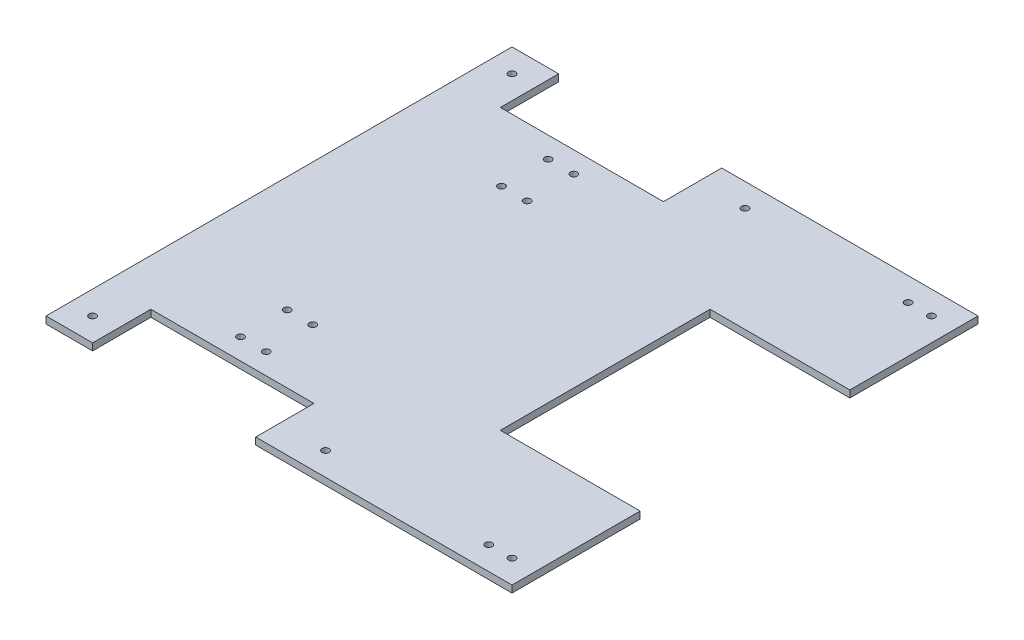
ISO-10303-21;
HEADER;
FILE_DESCRIPTION(('STEP AP214'),'2;1');
FILE_NAME('part.step','',(''),(''),'','','');
FILE_SCHEMA(('AUTOMOTIVE_DESIGN { 1 0 10303 214 1 1 1 1 }'));
ENDSEC;
DATA;
#1=APPLICATION_CONTEXT('core data for automotive mechanical design processes');
#2=APPLICATION_PROTOCOL_DEFINITION('international standard','automotive_design',2000,#1);
#3=PRODUCT_CONTEXT('',#1,'mechanical');
#4=PRODUCT('Part','Part','',(#3));
#5=PRODUCT_RELATED_PRODUCT_CATEGORY('part','',(#4));
#6=PRODUCT_DEFINITION_FORMATION('','',#4);
#7=PRODUCT_DEFINITION_CONTEXT('part definition',#1,'design');
#8=PRODUCT_DEFINITION('design','',#6,#7);
#9=PRODUCT_DEFINITION_SHAPE('','',#8);
#10=(LENGTH_UNIT() NAMED_UNIT(*) SI_UNIT(.MILLI.,.METRE.));
#11=(NAMED_UNIT(*) PLANE_ANGLE_UNIT() SI_UNIT($,.RADIAN.));
#12=(NAMED_UNIT(*) SI_UNIT($,.STERADIAN.) SOLID_ANGLE_UNIT());
#13=UNCERTAINTY_MEASURE_WITH_UNIT(LENGTH_MEASURE(1.E-05),#10,'distance_accuracy_value','');
#14=(GEOMETRIC_REPRESENTATION_CONTEXT(3) GLOBAL_UNCERTAINTY_ASSIGNED_CONTEXT((#13)) GLOBAL_UNIT_ASSIGNED_CONTEXT((#10,
#11,#12)) REPRESENTATION_CONTEXT('',''));
#15=CARTESIAN_POINT('',(0.,0.,0.));
#16=DIRECTION('',(0.,0.,1.));
#17=DIRECTION('',(1.,0.,0.));
#18=AXIS2_PLACEMENT_3D('',#15,#16,#17);
#19=CARTESIAN_POINT('',(180.,3.,130.));
#20=DIRECTION('',(-1.,0.,0.));
#21=DIRECTION('',(0.,0.,1.));
#22=AXIS2_PLACEMENT_3D('',#19,#20,#21);
#23=PLANE('',#22);
#24=DIRECTION('',(0.,0.,-1.));
#25=VECTOR('',#24,1.);
#26=CARTESIAN_POINT('',(180.,0.,130.));
#27=LINE('',#26,#25);
#28=CARTESIAN_POINT('',(180.,0.,130.));
#29=VERTEX_POINT('',#28);
#30=CARTESIAN_POINT('',(180.,0.,75.));
#31=VERTEX_POINT('',#30);
#32=EDGE_CURVE('E184',#29,#31,#27,.T.);
#33=ORIENTED_EDGE('',*,*,#32,.T.);
#34=DIRECTION('',(0.,1.,0.));
#35=VECTOR('',#34,1.);
#36=CARTESIAN_POINT('',(180.,0.,75.));
#37=LINE('',#36,#35);
#38=CARTESIAN_POINT('',(180.,3.,75.));
#39=VERTEX_POINT('',#38);
#40=EDGE_CURVE('E338',#31,#39,#37,.T.);
#41=ORIENTED_EDGE('',*,*,#40,.T.);
#42=DIRECTION('',(0.,0.,-1.));
#43=VECTOR('',#42,1.);
#44=CARTESIAN_POINT('',(180.,3.,130.));
#45=LINE('',#44,#43);
#46=CARTESIAN_POINT('',(180.,3.,130.));
#47=VERTEX_POINT('',#46);
#48=EDGE_CURVE('E247',#47,#39,#45,.T.);
#49=ORIENTED_EDGE('',*,*,#48,.F.);
#50=DIRECTION('',(0.,-1.,0.));
#51=VECTOR('',#50,1.);
#52=CARTESIAN_POINT('',(180.,3.,130.));
#53=LINE('',#52,#51);
#54=EDGE_CURVE('E205',#47,#29,#53,.T.);
#55=ORIENTED_EDGE('',*,*,#54,.T.);
#56=EDGE_LOOP('',(#33,#41,#49,#55));
#57=FACE_BOUND('',#56,.T.);
#58=ADVANCED_FACE('F34',(#57),#23,.F.);
#59=CARTESIAN_POINT('',(-20.,3.,-70.));
#60=DIRECTION('',(1.,0.,0.));
#61=DIRECTION('',(0.,0.,-1.));
#62=AXIS2_PLACEMENT_3D('',#59,#60,#61);
#63=PLANE('',#62);
#64=DIRECTION('',(0.,0.,1.));
#65=VECTOR('',#64,1.);
#66=CARTESIAN_POINT('',(-20.,0.,-70.));
#67=LINE('',#66,#65);
#68=CARTESIAN_POINT('',(-20.,0.,-70.));
#69=VERTEX_POINT('',#68);
#70=CARTESIAN_POINT('',(-20.,0.,130.));
#71=VERTEX_POINT('',#70);
#72=EDGE_CURVE('E169',#69,#71,#67,.T.);
#73=ORIENTED_EDGE('',*,*,#72,.T.);
#74=DIRECTION('',(0.,-1.,0.));
#75=VECTOR('',#74,1.);
#76=CARTESIAN_POINT('',(-20.,3.,130.));
#77=LINE('',#76,#75);
#78=CARTESIAN_POINT('',(-20.,3.,130.));
#79=VERTEX_POINT('',#78);
#80=EDGE_CURVE('E11',#79,#71,#77,.T.);
#81=ORIENTED_EDGE('',*,*,#80,.F.);
#82=DIRECTION('',(0.,0.,1.));
#83=VECTOR('',#82,1.);
#84=CARTESIAN_POINT('',(-20.,3.,-70.));
#85=LINE('',#84,#83);
#86=CARTESIAN_POINT('',(-20.,3.,-70.));
#87=VERTEX_POINT('',#86);
#88=EDGE_CURVE('E195',#87,#79,#85,.T.);
#89=ORIENTED_EDGE('',*,*,#88,.F.);
#90=DIRECTION('',(0.,-1.,0.));
#91=VECTOR('',#90,1.);
#92=CARTESIAN_POINT('',(-20.,3.,-70.));
#93=LINE('',#92,#91);
#94=EDGE_CURVE('E165',#87,#69,#93,.T.);
#95=ORIENTED_EDGE('',*,*,#94,.T.);
#96=EDGE_LOOP('',(#73,#81,#89,#95));
#97=FACE_BOUND('',#96,.T.);
#98=ADVANCED_FACE('F36',(#97),#63,.F.);
#99=CARTESIAN_POINT('',(-20.,3.,130.));
#100=DIRECTION('',(0.,0.,-1.));
#101=DIRECTION('',(-1.,0.,0.));
#102=AXIS2_PLACEMENT_3D('',#99,#100,#101);
#103=PLANE('',#102);
#104=DIRECTION('',(1.,0.,0.));
#105=VECTOR('',#104,1.);
#106=CARTESIAN_POINT('',(-20.,0.,130.));
#107=LINE('',#106,#105);
#108=CARTESIAN_POINT('',(0.,0.,130.));
#109=VERTEX_POINT('',#108);
#110=EDGE_CURVE('E172',#71,#109,#107,.T.);
#111=ORIENTED_EDGE('',*,*,#110,.T.);
#112=DIRECTION('',(0.,-1.,0.));
#113=VECTOR('',#112,1.);
#114=CARTESIAN_POINT('',(0.,3.,130.));
#115=LINE('',#114,#113);
#116=CARTESIAN_POINT('',(0.,3.,130.));
#117=VERTEX_POINT('',#116);
#118=EDGE_CURVE('E42',#117,#109,#115,.T.);
#119=ORIENTED_EDGE('',*,*,#118,.F.);
#120=DIRECTION('',(1.,0.,0.));
#121=VECTOR('',#120,1.);
#122=CARTESIAN_POINT('',(-20.,3.,130.));
#123=LINE('',#122,#121);
#124=EDGE_CURVE('E111',#79,#117,#123,.T.);
#125=ORIENTED_EDGE('',*,*,#124,.F.);
#126=ORIENTED_EDGE('',*,*,#80,.T.);
#127=EDGE_LOOP('',(#111,#119,#125,#126));
#128=FACE_BOUND('',#127,.T.);
#129=ADVANCED_FACE('F434',(#128),#103,.F.);
#130=CARTESIAN_POINT('',(0.,3.,130.));
#131=DIRECTION('',(-1.,0.,0.));
#132=DIRECTION('',(0.,0.,1.));
#133=AXIS2_PLACEMENT_3D('',#130,#131,#132);
#134=PLANE('',#133);
#135=DIRECTION('',(0.,0.,-1.));
#136=VECTOR('',#135,1.);
#137=CARTESIAN_POINT('',(0.,0.,130.));
#138=LINE('',#137,#136);
#139=CARTESIAN_POINT('',(0.,0.,105.));
#140=VERTEX_POINT('',#139);
#141=EDGE_CURVE('E175',#109,#140,#138,.T.);
#142=ORIENTED_EDGE('',*,*,#141,.T.);
#143=DIRECTION('',(0.,-1.,0.));
#144=VECTOR('',#143,1.);
#145=CARTESIAN_POINT('',(0.,3.,105.));
#146=LINE('',#145,#144);
#147=CARTESIAN_POINT('',(0.,3.,105.));
#148=VERTEX_POINT('',#147);
#149=EDGE_CURVE('E214',#148,#140,#146,.T.);
#150=ORIENTED_EDGE('',*,*,#149,.F.);
#151=DIRECTION('',(0.,0.,-1.));
#152=VECTOR('',#151,1.);
#153=CARTESIAN_POINT('',(0.,3.,130.));
#154=LINE('',#153,#152);
#155=EDGE_CURVE('E222',#117,#148,#154,.T.);
#156=ORIENTED_EDGE('',*,*,#155,.F.);
#157=ORIENTED_EDGE('',*,*,#118,.T.);
#158=EDGE_LOOP('',(#142,#150,#156,#157));
#159=FACE_BOUND('',#158,.T.);
#160=ADVANCED_FACE('F220',(#159),#134,.F.);
#161=CARTESIAN_POINT('',(0.,3.,105.));
#162=DIRECTION('',(0.,0.,-1.));
#163=DIRECTION('',(-1.,0.,0.));
#164=AXIS2_PLACEMENT_3D('',#161,#162,#163);
#165=PLANE('',#164);
#166=DIRECTION('',(1.,0.,0.));
#167=VECTOR('',#166,1.);
#168=CARTESIAN_POINT('',(0.,0.,105.));
#169=LINE('',#168,#167);
#170=CARTESIAN_POINT('',(70.,0.,105.));
#171=VERTEX_POINT('',#170);
#172=EDGE_CURVE('E177',#140,#171,#169,.T.);
#173=ORIENTED_EDGE('',*,*,#172,.T.);
#174=DIRECTION('',(0.,-1.,0.));
#175=VECTOR('',#174,1.);
#176=CARTESIAN_POINT('',(70.,3.,105.));
#177=LINE('',#176,#175);
#178=CARTESIAN_POINT('',(70.,3.,105.));
#179=VERTEX_POINT('',#178);
#180=EDGE_CURVE('E211',#179,#171,#177,.T.);
#181=ORIENTED_EDGE('',*,*,#180,.F.);
#182=DIRECTION('',(1.,0.,0.));
#183=VECTOR('',#182,1.);
#184=CARTESIAN_POINT('',(0.,3.,105.));
#185=LINE('',#184,#183);
#186=EDGE_CURVE('E240',#148,#179,#185,.T.);
#187=ORIENTED_EDGE('',*,*,#186,.F.);
#188=ORIENTED_EDGE('',*,*,#149,.T.);
#189=EDGE_LOOP('',(#173,#181,#187,#188));
#190=FACE_BOUND('',#189,.T.);
#191=ADVANCED_FACE('F231',(#190),#165,.F.);
#192=CARTESIAN_POINT('',(70.,3.,105.));
#193=DIRECTION('',(1.,0.,0.));
#194=DIRECTION('',(0.,0.,-1.));
#195=AXIS2_PLACEMENT_3D('',#192,#193,#194);
#196=PLANE('',#195);
#197=DIRECTION('',(0.,0.,1.));
#198=VECTOR('',#197,1.);
#199=CARTESIAN_POINT('',(70.,0.,105.));
#200=LINE('',#199,#198);
#201=CARTESIAN_POINT('',(70.,0.,130.));
#202=VERTEX_POINT('',#201);
#203=EDGE_CURVE('E179',#171,#202,#200,.T.);
#204=ORIENTED_EDGE('',*,*,#203,.T.);
#205=DIRECTION('',(0.,-1.,0.));
#206=VECTOR('',#205,1.);
#207=CARTESIAN_POINT('',(70.,3.,130.));
#208=LINE('',#207,#206);
#209=CARTESIAN_POINT('',(70.,3.,130.));
#210=VERTEX_POINT('',#209);
#211=EDGE_CURVE('E208',#210,#202,#208,.T.);
#212=ORIENTED_EDGE('',*,*,#211,.F.);
#213=DIRECTION('',(0.,0.,1.));
#214=VECTOR('',#213,1.);
#215=CARTESIAN_POINT('',(70.,3.,105.));
#216=LINE('',#215,#214);
#217=EDGE_CURVE('E237',#179,#210,#216,.T.);
#218=ORIENTED_EDGE('',*,*,#217,.F.);
#219=ORIENTED_EDGE('',*,*,#180,.T.);
#220=EDGE_LOOP('',(#204,#212,#218,#219));
#221=FACE_BOUND('',#220,.T.);
#222=ADVANCED_FACE('F235',(#221),#196,.F.);
#223=CARTESIAN_POINT('',(70.,3.,130.));
#224=DIRECTION('',(0.,0.,-1.));
#225=DIRECTION('',(-1.,0.,0.));
#226=AXIS2_PLACEMENT_3D('',#223,#224,#225);
#227=PLANE('',#226);
#228=DIRECTION('',(1.,0.,0.));
#229=VECTOR('',#228,1.);
#230=CARTESIAN_POINT('',(70.,0.,130.));
#231=LINE('',#230,#229);
#232=EDGE_CURVE('E181',#202,#29,#231,.T.);
#233=ORIENTED_EDGE('',*,*,#232,.T.);
#234=ORIENTED_EDGE('',*,*,#54,.F.);
#235=DIRECTION('',(1.,0.,0.));
#236=VECTOR('',#235,1.);
#237=CARTESIAN_POINT('',(70.,3.,130.));
#238=LINE('',#237,#236);
#239=EDGE_CURVE('E239',#210,#47,#238,.T.);
#240=ORIENTED_EDGE('',*,*,#239,.F.);
#241=ORIENTED_EDGE('',*,*,#211,.T.);
#242=EDGE_LOOP('',(#233,#234,#240,#241));
#243=FACE_BOUND('',#242,.T.);
#244=ADVANCED_FACE('F438',(#243),#227,.F.);
#245=CARTESIAN_POINT('',(180.,3.,-15.));
#246=VERTEX_POINT('',#245);
#247=CARTESIAN_POINT('',(180.,3.,-70.));
#248=VERTEX_POINT('',#247);
#249=EDGE_CURVE('E242',#246,#248,#45,.T.);
#250=ORIENTED_EDGE('',*,*,#249,.F.);
#251=DIRECTION('',(0.,1.,0.));
#252=VECTOR('',#251,1.);
#253=CARTESIAN_POINT('',(180.,0.,-15.));
#254=LINE('',#253,#252);
#255=CARTESIAN_POINT('',(180.,0.,-15.));
#256=VERTEX_POINT('',#255);
#257=EDGE_CURVE('E341',#256,#246,#254,.T.);
#258=ORIENTED_EDGE('',*,*,#257,.F.);
#259=CARTESIAN_POINT('',(180.,0.,-70.));
#260=VERTEX_POINT('',#259);
#261=EDGE_CURVE('E183',#256,#260,#27,.T.);
#262=ORIENTED_EDGE('',*,*,#261,.T.);
#263=DIRECTION('',(0.,-1.,0.));
#264=VECTOR('',#263,1.);
#265=CARTESIAN_POINT('',(180.,3.,-70.));
#266=LINE('',#265,#264);
#267=EDGE_CURVE('E202',#248,#260,#266,.T.);
#268=ORIENTED_EDGE('',*,*,#267,.F.);
#269=EDGE_LOOP('',(#250,#258,#262,#268));
#270=FACE_BOUND('',#269,.T.);
#271=ADVANCED_FACE('F430',(#270),#23,.F.);
#272=CARTESIAN_POINT('',(180.,3.,-70.));
#273=DIRECTION('',(0.,0.,1.));
#274=DIRECTION('',(1.,0.,0.));
#275=AXIS2_PLACEMENT_3D('',#272,#273,#274);
#276=PLANE('',#275);
#277=DIRECTION('',(-1.,0.,0.));
#278=VECTOR('',#277,1.);
#279=CARTESIAN_POINT('',(180.,0.,-70.));
#280=LINE('',#279,#278);
#281=CARTESIAN_POINT('',(70.,0.,-70.));
#282=VERTEX_POINT('',#281);
#283=EDGE_CURVE('E187',#260,#282,#280,.T.);
#284=ORIENTED_EDGE('',*,*,#283,.T.);
#285=DIRECTION('',(0.,-1.,0.));
#286=VECTOR('',#285,1.);
#287=CARTESIAN_POINT('',(70.,3.,-70.));
#288=LINE('',#287,#286);
#289=CARTESIAN_POINT('',(70.,3.,-70.));
#290=VERTEX_POINT('',#289);
#291=EDGE_CURVE('E199',#290,#282,#288,.T.);
#292=ORIENTED_EDGE('',*,*,#291,.F.);
#293=DIRECTION('',(-1.,0.,0.));
#294=VECTOR('',#293,1.);
#295=CARTESIAN_POINT('',(180.,3.,-70.));
#296=LINE('',#295,#294);
#297=EDGE_CURVE('E250',#248,#290,#296,.T.);
#298=ORIENTED_EDGE('',*,*,#297,.F.);
#299=ORIENTED_EDGE('',*,*,#267,.T.);
#300=EDGE_LOOP('',(#284,#292,#298,#299));
#301=FACE_BOUND('',#300,.T.);
#302=ADVANCED_FACE('F257',(#301),#276,.F.);
#303=CARTESIAN_POINT('',(70.,3.,-70.));
#304=DIRECTION('',(1.,0.,0.));
#305=DIRECTION('',(0.,0.,-1.));
#306=AXIS2_PLACEMENT_3D('',#303,#304,#305);
#307=PLANE('',#306);
#308=DIRECTION('',(0.,0.,1.));
#309=VECTOR('',#308,1.);
#310=CARTESIAN_POINT('',(70.,0.,-70.));
#311=LINE('',#310,#309);
#312=CARTESIAN_POINT('',(70.,0.,-45.));
#313=VERTEX_POINT('',#312);
#314=EDGE_CURVE('E189',#282,#313,#311,.T.);
#315=ORIENTED_EDGE('',*,*,#314,.T.);
#316=DIRECTION('',(0.,-1.,0.));
#317=VECTOR('',#316,1.);
#318=CARTESIAN_POINT('',(70.,3.,-45.));
#319=LINE('',#318,#317);
#320=CARTESIAN_POINT('',(70.,3.,-45.));
#321=VERTEX_POINT('',#320);
#322=EDGE_CURVE('E160',#321,#313,#319,.T.);
#323=ORIENTED_EDGE('',*,*,#322,.F.);
#324=DIRECTION('',(0.,0.,1.));
#325=VECTOR('',#324,1.);
#326=CARTESIAN_POINT('',(70.,3.,-70.));
#327=LINE('',#326,#325);
#328=EDGE_CURVE('E148',#290,#321,#327,.T.);
#329=ORIENTED_EDGE('',*,*,#328,.F.);
#330=ORIENTED_EDGE('',*,*,#291,.T.);
#331=EDGE_LOOP('',(#315,#323,#329,#330));
#332=FACE_BOUND('',#331,.T.);
#333=ADVANCED_FACE('F261',(#332),#307,.F.);
#334=CARTESIAN_POINT('',(70.,3.,-45.));
#335=DIRECTION('',(0.,0.,1.));
#336=DIRECTION('',(1.,0.,0.));
#337=AXIS2_PLACEMENT_3D('',#334,#335,#336);
#338=PLANE('',#337);
#339=DIRECTION('',(-1.,0.,0.));
#340=VECTOR('',#339,1.);
#341=CARTESIAN_POINT('',(70.,0.,-45.));
#342=LINE('',#341,#340);
#343=CARTESIAN_POINT('',(0.,0.,-45.));
#344=VERTEX_POINT('',#343);
#345=EDGE_CURVE('E157',#313,#344,#342,.T.);
#346=ORIENTED_EDGE('',*,*,#345,.T.);
#347=DIRECTION('',(0.,-1.,0.));
#348=VECTOR('',#347,1.);
#349=CARTESIAN_POINT('',(0.,3.,-45.));
#350=LINE('',#349,#348);
#351=CARTESIAN_POINT('',(0.,3.,-45.));
#352=VERTEX_POINT('',#351);
#353=EDGE_CURVE('E154',#352,#344,#350,.T.);
#354=ORIENTED_EDGE('',*,*,#353,.F.);
#355=DIRECTION('',(-1.,0.,0.));
#356=VECTOR('',#355,1.);
#357=CARTESIAN_POINT('',(70.,3.,-45.));
#358=LINE('',#357,#356);
#359=EDGE_CURVE('E139',#321,#352,#358,.T.);
#360=ORIENTED_EDGE('',*,*,#359,.F.);
#361=ORIENTED_EDGE('',*,*,#322,.T.);
#362=EDGE_LOOP('',(#346,#354,#360,#361));
#363=FACE_BOUND('',#362,.T.);
#364=ADVANCED_FACE('F155',(#363),#338,.F.);
#365=CARTESIAN_POINT('',(0.,3.,-45.));
#366=DIRECTION('',(-1.,0.,0.));
#367=DIRECTION('',(0.,0.,1.));
#368=AXIS2_PLACEMENT_3D('',#365,#366,#367);
#369=PLANE('',#368);
#370=DIRECTION('',(0.,0.,-1.));
#371=VECTOR('',#370,1.);
#372=CARTESIAN_POINT('',(0.,0.,-45.));
#373=LINE('',#372,#371);
#374=CARTESIAN_POINT('',(0.,0.,-70.));
#375=VERTEX_POINT('',#374);
#376=EDGE_CURVE('E192',#344,#375,#373,.T.);
#377=ORIENTED_EDGE('',*,*,#376,.T.);
#378=DIRECTION('',(0.,-1.,0.));
#379=VECTOR('',#378,1.);
#380=CARTESIAN_POINT('',(0.,3.,-70.));
#381=LINE('',#380,#379);
#382=CARTESIAN_POINT('',(0.,3.,-70.));
#383=VERTEX_POINT('',#382);
#384=EDGE_CURVE('E161',#383,#375,#381,.T.);
#385=ORIENTED_EDGE('',*,*,#384,.F.);
#386=DIRECTION('',(0.,0.,-1.));
#387=VECTOR('',#386,1.);
#388=CARTESIAN_POINT('',(0.,3.,-45.));
#389=LINE('',#388,#387);
#390=EDGE_CURVE('E145',#352,#383,#389,.T.);
#391=ORIENTED_EDGE('',*,*,#390,.F.);
#392=ORIENTED_EDGE('',*,*,#353,.T.);
#393=EDGE_LOOP('',(#377,#385,#391,#392));
#394=FACE_BOUND('',#393,.T.);
#395=ADVANCED_FACE('F163',(#394),#369,.F.);
#396=CARTESIAN_POINT('',(0.,3.,-70.));
#397=DIRECTION('',(0.,0.,1.));
#398=DIRECTION('',(1.,0.,0.));
#399=AXIS2_PLACEMENT_3D('',#396,#397,#398);
#400=PLANE('',#399);
#401=DIRECTION('',(-1.,0.,0.));
#402=VECTOR('',#401,1.);
#403=CARTESIAN_POINT('',(0.,0.,-70.));
#404=LINE('',#403,#402);
#405=EDGE_CURVE('E103',#375,#69,#404,.T.);
#406=ORIENTED_EDGE('',*,*,#405,.T.);
#407=ORIENTED_EDGE('',*,*,#94,.F.);
#408=DIRECTION('',(-1.,0.,0.));
#409=VECTOR('',#408,1.);
#410=CARTESIAN_POINT('',(0.,3.,-70.));
#411=LINE('',#410,#409);
#412=EDGE_CURVE('E58',#383,#87,#411,.T.);
#413=ORIENTED_EDGE('',*,*,#412,.F.);
#414=ORIENTED_EDGE('',*,*,#384,.T.);
#415=EDGE_LOOP('',(#406,#407,#413,#414));
#416=FACE_BOUND('',#415,.T.);
#417=ADVANCED_FACE('F262',(#416),#400,.F.);
#418=CARTESIAN_POINT('',(0.,3.,0.));
#419=DIRECTION('',(0.,1.,0.));
#420=DIRECTION('',(0.,0.,1.));
#421=AXIS2_PLACEMENT_3D('',#418,#419,#420);
#422=PLANE('',#421);
#423=CARTESIAN_POINT('',(-9.99999999999998,3.,-60.));
#424=DIRECTION('',(0.,1.,0.));
#425=DIRECTION('',(0.,0.,-1.));
#426=AXIS2_PLACEMENT_3D('',#423,#424,#425);
#427=CIRCLE('',#426,1.5);
#428=CARTESIAN_POINT('',(-9.99999999999998,3.,-61.5));
#429=VERTEX_POINT('',#428);
#430=EDGE_CURVE('E386',#429,#429,#427,.T.);
#431=ORIENTED_EDGE('',*,*,#430,.F.);
#432=EDGE_LOOP('',(#431));
#433=FACE_BOUND('',#432,.T.);
#434=CARTESIAN_POINT('',(160.,3.,-60.));
#435=DIRECTION('',(0.,1.,0.));
#436=DIRECTION('',(0.,0.,-1.));
#437=AXIS2_PLACEMENT_3D('',#434,#435,#436);
#438=CIRCLE('',#437,1.5);
#439=CARTESIAN_POINT('',(160.,3.,-61.5));
#440=VERTEX_POINT('',#439);
#441=EDGE_CURVE('E380',#440,#440,#438,.T.);
#442=ORIENTED_EDGE('',*,*,#441,.F.);
#443=EDGE_LOOP('',(#442));
#444=FACE_BOUND('',#443,.T.);
#445=CARTESIAN_POINT('',(160.,3.,120.));
#446=DIRECTION('',(0.,1.,0.));
#447=DIRECTION('',(0.,0.,1.));
#448=AXIS2_PLACEMENT_3D('',#445,#446,#447);
#449=CIRCLE('',#448,1.5);
#450=CARTESIAN_POINT('',(160.,3.,121.5));
#451=VERTEX_POINT('',#450);
#452=EDGE_CURVE('E374',#451,#451,#449,.T.);
#453=ORIENTED_EDGE('',*,*,#452,.F.);
#454=EDGE_LOOP('',(#453));
#455=FACE_BOUND('',#454,.T.);
#456=CARTESIAN_POINT('',(-9.99999999999998,3.,120.));
#457=DIRECTION('',(0.,1.,0.));
#458=DIRECTION('',(0.,0.,1.));
#459=AXIS2_PLACEMENT_3D('',#456,#457,#458);
#460=CIRCLE('',#459,1.5);
#461=CARTESIAN_POINT('',(-9.99999999999998,3.,121.5));
#462=VERTEX_POINT('',#461);
#463=EDGE_CURVE('E368',#462,#462,#460,.T.);
#464=ORIENTED_EDGE('',*,*,#463,.F.);
#465=EDGE_LOOP('',(#464));
#466=FACE_BOUND('',#465,.T.);
#467=DIRECTION('',(1.,0.,0.));
#468=VECTOR('',#467,1.);
#469=CARTESIAN_POINT('',(180.,3.,75.));
#470=LINE('',#469,#468);
#471=CARTESIAN_POINT('',(120.,3.,75.));
#472=VERTEX_POINT('',#471);
#473=EDGE_CURVE('E352',#472,#39,#470,.T.);
#474=ORIENTED_EDGE('',*,*,#473,.F.);
#475=DIRECTION('',(0.,0.,1.));
#476=VECTOR('',#475,1.);
#477=CARTESIAN_POINT('',(120.,3.,-15.));
#478=LINE('',#477,#476);
#479=CARTESIAN_POINT('',(120.,3.,-15.));
#480=VERTEX_POINT('',#479);
#481=EDGE_CURVE('E356',#480,#472,#478,.T.);
#482=ORIENTED_EDGE('',*,*,#481,.F.);
#483=DIRECTION('',(-1.,0.,0.));
#484=VECTOR('',#483,1.);
#485=CARTESIAN_POINT('',(180.,3.,-15.));
#486=LINE('',#485,#484);
#487=EDGE_CURVE('E359',#246,#480,#486,.T.);
#488=ORIENTED_EDGE('',*,*,#487,.F.);
#489=ORIENTED_EDGE('',*,*,#249,.T.);
#490=ORIENTED_EDGE('',*,*,#297,.T.);
#491=ORIENTED_EDGE('',*,*,#328,.T.);
#492=ORIENTED_EDGE('',*,*,#359,.T.);
#493=ORIENTED_EDGE('',*,*,#390,.T.);
#494=ORIENTED_EDGE('',*,*,#412,.T.);
#495=ORIENTED_EDGE('',*,*,#88,.T.);
#496=ORIENTED_EDGE('',*,*,#124,.T.);
#497=ORIENTED_EDGE('',*,*,#155,.T.);
#498=ORIENTED_EDGE('',*,*,#186,.T.);
#499=ORIENTED_EDGE('',*,*,#217,.T.);
#500=ORIENTED_EDGE('',*,*,#239,.T.);
#501=ORIENTED_EDGE('',*,*,#48,.T.);
#502=EDGE_LOOP('',(#474,#482,#488,#489,#490,#491,#492,#493,#494,#495,#496,#497,#498,#499,#500,#501));
#503=FACE_BOUND('',#502,.T.);
#504=CARTESIAN_POINT('',(90.0000000000001,3.,-60.));
#505=DIRECTION('',(0.,1.,0.));
#506=DIRECTION('',(0.,0.,1.));
#507=AXIS2_PLACEMENT_3D('',#504,#505,#506);
#508=CIRCLE('',#507,1.5);
#509=CARTESIAN_POINT('',(90.0000000000001,3.,-58.5));
#510=VERTEX_POINT('',#509);
#511=EDGE_CURVE('E335',#510,#510,#508,.T.);
#512=ORIENTED_EDGE('',*,*,#511,.F.);
#513=EDGE_LOOP('',(#512));
#514=FACE_BOUND('',#513,.T.);
#515=CARTESIAN_POINT('',(90.0000000000001,3.,120.));
#516=DIRECTION('',(0.,1.,0.));
#517=DIRECTION('',(0.,0.,-1.));
#518=AXIS2_PLACEMENT_3D('',#515,#516,#517);
#519=CIRCLE('',#518,1.5);
#520=CARTESIAN_POINT('',(90.0000000000001,3.,118.5));
#521=VERTEX_POINT('',#520);
#522=EDGE_CURVE('E329',#521,#521,#519,.T.);
#523=ORIENTED_EDGE('',*,*,#522,.F.);
#524=EDGE_LOOP('',(#523));
#525=FACE_BOUND('',#524,.T.);
#526=CARTESIAN_POINT('',(170.,3.,-60.));
#527=DIRECTION('',(0.,1.,0.));
#528=DIRECTION('',(0.,0.,-1.));
#529=AXIS2_PLACEMENT_3D('',#526,#527,#528);
#530=CIRCLE('',#529,1.5);
#531=CARTESIAN_POINT('',(170.,3.,-61.5));
#532=VERTEX_POINT('',#531);
#533=EDGE_CURVE('E323',#532,#532,#530,.T.);
#534=ORIENTED_EDGE('',*,*,#533,.F.);
#535=EDGE_LOOP('',(#534));
#536=FACE_BOUND('',#535,.T.);
#537=CARTESIAN_POINT('',(170.,3.,120.));
#538=DIRECTION('',(0.,1.,0.));
#539=DIRECTION('',(0.,0.,1.));
#540=AXIS2_PLACEMENT_3D('',#537,#538,#539);
#541=CIRCLE('',#540,1.5);
#542=CARTESIAN_POINT('',(170.,3.,121.5));
#543=VERTEX_POINT('',#542);
#544=EDGE_CURVE('E317',#543,#543,#541,.T.);
#545=ORIENTED_EDGE('',*,*,#544,.F.);
#546=EDGE_LOOP('',(#545));
#547=FACE_BOUND('',#546,.T.);
#548=CARTESIAN_POINT('',(29.5,3.,-16.));
#549=DIRECTION('',(0.,1.,0.));
#550=DIRECTION('',(0.,0.,-1.));
#551=AXIS2_PLACEMENT_3D('',#548,#549,#550);
#552=CIRCLE('',#551,1.5);
#553=CARTESIAN_POINT('',(29.5,3.,-17.5));
#554=VERTEX_POINT('',#553);
#555=EDGE_CURVE('E311',#554,#554,#552,.T.);
#556=ORIENTED_EDGE('',*,*,#555,.F.);
#557=EDGE_LOOP('',(#556));
#558=FACE_BOUND('',#557,.T.);
#559=CARTESIAN_POINT('',(40.5,3.,-16.));
#560=DIRECTION('',(0.,1.,0.));
#561=DIRECTION('',(0.,0.,1.));
#562=AXIS2_PLACEMENT_3D('',#559,#560,#561);
#563=CIRCLE('',#562,1.5);
#564=CARTESIAN_POINT('',(40.5,3.,-14.5));
#565=VERTEX_POINT('',#564);
#566=EDGE_CURVE('E305',#565,#565,#563,.T.);
#567=ORIENTED_EDGE('',*,*,#566,.F.);
#568=EDGE_LOOP('',(#567));
#569=FACE_BOUND('',#568,.T.);
#570=CARTESIAN_POINT('',(40.5,3.,-36.));
#571=DIRECTION('',(0.,1.,0.));
#572=DIRECTION('',(0.,0.,1.));
#573=AXIS2_PLACEMENT_3D('',#570,#571,#572);
#574=CIRCLE('',#573,1.5);
#575=CARTESIAN_POINT('',(40.5,3.,-34.5));
#576=VERTEX_POINT('',#575);
#577=EDGE_CURVE('E299',#576,#576,#574,.T.);
#578=ORIENTED_EDGE('',*,*,#577,.F.);
#579=EDGE_LOOP('',(#578));
#580=FACE_BOUND('',#579,.T.);
#581=CARTESIAN_POINT('',(29.5,3.,-36.));
#582=DIRECTION('',(0.,1.,0.));
#583=DIRECTION('',(0.,0.,-1.));
#584=AXIS2_PLACEMENT_3D('',#581,#582,#583);
#585=CIRCLE('',#584,1.5);
#586=CARTESIAN_POINT('',(29.5,3.,-37.5));
#587=VERTEX_POINT('',#586);
#588=EDGE_CURVE('E293',#587,#587,#585,.T.);
#589=ORIENTED_EDGE('',*,*,#588,.F.);
#590=EDGE_LOOP('',(#589));
#591=FACE_BOUND('',#590,.T.);
#592=CARTESIAN_POINT('',(40.5,3.,76.));
#593=DIRECTION('',(0.,1.,0.));
#594=DIRECTION('',(0.,0.,-1.));
#595=AXIS2_PLACEMENT_3D('',#592,#593,#594);
#596=CIRCLE('',#595,1.5);
#597=CARTESIAN_POINT('',(40.5,3.,74.5));
#598=VERTEX_POINT('',#597);
#599=EDGE_CURVE('E287',#598,#598,#596,.T.);
#600=ORIENTED_EDGE('',*,*,#599,.F.);
#601=EDGE_LOOP('',(#600));
#602=FACE_BOUND('',#601,.T.);
#603=CARTESIAN_POINT('',(40.5,3.,96.));
#604=DIRECTION('',(0.,1.,0.));
#605=DIRECTION('',(0.,0.,-1.));
#606=AXIS2_PLACEMENT_3D('',#603,#604,#605);
#607=CIRCLE('',#606,1.5);
#608=CARTESIAN_POINT('',(40.5,3.,94.5));
#609=VERTEX_POINT('',#608);
#610=EDGE_CURVE('E281',#609,#609,#607,.T.);
#611=ORIENTED_EDGE('',*,*,#610,.F.);
#612=EDGE_LOOP('',(#611));
#613=FACE_BOUND('',#612,.T.);
#614=CARTESIAN_POINT('',(29.5,3.,76.));
#615=DIRECTION('',(0.,1.,0.));
#616=DIRECTION('',(0.,0.,1.));
#617=AXIS2_PLACEMENT_3D('',#614,#615,#616);
#618=CIRCLE('',#617,1.5);
#619=CARTESIAN_POINT('',(29.5,3.,77.5));
#620=VERTEX_POINT('',#619);
#621=EDGE_CURVE('E275',#620,#620,#618,.T.);
#622=ORIENTED_EDGE('',*,*,#621,.F.);
#623=EDGE_LOOP('',(#622));
#624=FACE_BOUND('',#623,.T.);
#625=CARTESIAN_POINT('',(29.5,3.,96.));
#626=DIRECTION('',(0.,1.,0.));
#627=DIRECTION('',(0.,0.,1.));
#628=AXIS2_PLACEMENT_3D('',#625,#626,#627);
#629=CIRCLE('',#628,1.5);
#630=CARTESIAN_POINT('',(29.5,3.,97.5));
#631=VERTEX_POINT('',#630);
#632=EDGE_CURVE('E269',#631,#631,#629,.T.);
#633=ORIENTED_EDGE('',*,*,#632,.F.);
#634=EDGE_LOOP('',(#633));
#635=FACE_BOUND('',#634,.T.);
#636=ADVANCED_FACE('F142',(#433,#444,#455,#466,#503,#514,#525,#536,#547,#558,#569,#580,#591,
#602,#613,#624,#635),#422,.T.);
#637=CARTESIAN_POINT('',(0.,0.,0.));
#638=DIRECTION('',(0.,1.,0.));
#639=DIRECTION('',(0.,0.,1.));
#640=AXIS2_PLACEMENT_3D('',#637,#638,#639);
#641=PLANE('',#640);
#642=CARTESIAN_POINT('',(-9.99999999999998,0.,-60.));
#643=DIRECTION('',(0.,1.,0.));
#644=DIRECTION('',(0.,0.,-1.));
#645=AXIS2_PLACEMENT_3D('',#642,#643,#644);
#646=CIRCLE('',#645,1.5);
#647=CARTESIAN_POINT('',(-9.99999999999998,0.,-61.5));
#648=VERTEX_POINT('',#647);
#649=EDGE_CURVE('E383',#648,#648,#646,.T.);
#650=ORIENTED_EDGE('',*,*,#649,.T.);
#651=EDGE_LOOP('',(#650));
#652=FACE_BOUND('',#651,.T.);
#653=CARTESIAN_POINT('',(160.,0.,-60.));
#654=DIRECTION('',(0.,1.,0.));
#655=DIRECTION('',(0.,0.,-1.));
#656=AXIS2_PLACEMENT_3D('',#653,#654,#655);
#657=CIRCLE('',#656,1.5);
#658=CARTESIAN_POINT('',(160.,0.,-61.5));
#659=VERTEX_POINT('',#658);
#660=EDGE_CURVE('E377',#659,#659,#657,.T.);
#661=ORIENTED_EDGE('',*,*,#660,.T.);
#662=EDGE_LOOP('',(#661));
#663=FACE_BOUND('',#662,.T.);
#664=CARTESIAN_POINT('',(160.,0.,120.));
#665=DIRECTION('',(0.,1.,0.));
#666=DIRECTION('',(0.,0.,1.));
#667=AXIS2_PLACEMENT_3D('',#664,#665,#666);
#668=CIRCLE('',#667,1.5);
#669=CARTESIAN_POINT('',(160.,0.,121.5));
#670=VERTEX_POINT('',#669);
#671=EDGE_CURVE('E371',#670,#670,#668,.T.);
#672=ORIENTED_EDGE('',*,*,#671,.T.);
#673=EDGE_LOOP('',(#672));
#674=FACE_BOUND('',#673,.T.);
#675=CARTESIAN_POINT('',(-9.99999999999998,0.,120.));
#676=DIRECTION('',(0.,1.,0.));
#677=DIRECTION('',(0.,0.,1.));
#678=AXIS2_PLACEMENT_3D('',#675,#676,#677);
#679=CIRCLE('',#678,1.5);
#680=CARTESIAN_POINT('',(-9.99999999999998,0.,121.5));
#681=VERTEX_POINT('',#680);
#682=EDGE_CURVE('E362',#681,#681,#679,.T.);
#683=ORIENTED_EDGE('',*,*,#682,.T.);
#684=EDGE_LOOP('',(#683));
#685=FACE_BOUND('',#684,.T.);
#686=CARTESIAN_POINT('',(90.0000000000001,0.,-60.));
#687=DIRECTION('',(0.,1.,0.));
#688=DIRECTION('',(0.,0.,1.));
#689=AXIS2_PLACEMENT_3D('',#686,#687,#688);
#690=CIRCLE('',#689,1.5);
#691=CARTESIAN_POINT('',(90.0000000000001,0.,-58.5));
#692=VERTEX_POINT('',#691);
#693=EDGE_CURVE('E332',#692,#692,#690,.T.);
#694=ORIENTED_EDGE('',*,*,#693,.T.);
#695=EDGE_LOOP('',(#694));
#696=FACE_BOUND('',#695,.T.);
#697=CARTESIAN_POINT('',(90.0000000000001,0.,120.));
#698=DIRECTION('',(0.,1.,0.));
#699=DIRECTION('',(0.,0.,-1.));
#700=AXIS2_PLACEMENT_3D('',#697,#698,#699);
#701=CIRCLE('',#700,1.5);
#702=CARTESIAN_POINT('',(90.0000000000001,0.,118.5));
#703=VERTEX_POINT('',#702);
#704=EDGE_CURVE('E326',#703,#703,#701,.T.);
#705=ORIENTED_EDGE('',*,*,#704,.T.);
#706=EDGE_LOOP('',(#705));
#707=FACE_BOUND('',#706,.T.);
#708=CARTESIAN_POINT('',(170.,0.,-60.));
#709=DIRECTION('',(0.,1.,0.));
#710=DIRECTION('',(0.,0.,-1.));
#711=AXIS2_PLACEMENT_3D('',#708,#709,#710);
#712=CIRCLE('',#711,1.5);
#713=CARTESIAN_POINT('',(170.,0.,-61.5));
#714=VERTEX_POINT('',#713);
#715=EDGE_CURVE('E320',#714,#714,#712,.T.);
#716=ORIENTED_EDGE('',*,*,#715,.T.);
#717=EDGE_LOOP('',(#716));
#718=FACE_BOUND('',#717,.T.);
#719=CARTESIAN_POINT('',(170.,0.,120.));
#720=DIRECTION('',(0.,1.,0.));
#721=DIRECTION('',(0.,0.,1.));
#722=AXIS2_PLACEMENT_3D('',#719,#720,#721);
#723=CIRCLE('',#722,1.5);
#724=CARTESIAN_POINT('',(170.,0.,121.5));
#725=VERTEX_POINT('',#724);
#726=EDGE_CURVE('E314',#725,#725,#723,.T.);
#727=ORIENTED_EDGE('',*,*,#726,.T.);
#728=EDGE_LOOP('',(#727));
#729=FACE_BOUND('',#728,.T.);
#730=CARTESIAN_POINT('',(29.5,0.,-16.));
#731=DIRECTION('',(0.,1.,0.));
#732=DIRECTION('',(0.,0.,-1.));
#733=AXIS2_PLACEMENT_3D('',#730,#731,#732);
#734=CIRCLE('',#733,1.5);
#735=CARTESIAN_POINT('',(29.5,0.,-17.5));
#736=VERTEX_POINT('',#735);
#737=EDGE_CURVE('E308',#736,#736,#734,.T.);
#738=ORIENTED_EDGE('',*,*,#737,.T.);
#739=EDGE_LOOP('',(#738));
#740=FACE_BOUND('',#739,.T.);
#741=CARTESIAN_POINT('',(40.5,0.,-16.));
#742=DIRECTION('',(0.,1.,0.));
#743=DIRECTION('',(0.,0.,1.));
#744=AXIS2_PLACEMENT_3D('',#741,#742,#743);
#745=CIRCLE('',#744,1.5);
#746=CARTESIAN_POINT('',(40.5,0.,-14.5));
#747=VERTEX_POINT('',#746);
#748=EDGE_CURVE('E302',#747,#747,#745,.T.);
#749=ORIENTED_EDGE('',*,*,#748,.T.);
#750=EDGE_LOOP('',(#749));
#751=FACE_BOUND('',#750,.T.);
#752=CARTESIAN_POINT('',(40.5,0.,-36.));
#753=DIRECTION('',(0.,1.,0.));
#754=DIRECTION('',(0.,0.,1.));
#755=AXIS2_PLACEMENT_3D('',#752,#753,#754);
#756=CIRCLE('',#755,1.5);
#757=CARTESIAN_POINT('',(40.5,0.,-34.5));
#758=VERTEX_POINT('',#757);
#759=EDGE_CURVE('E296',#758,#758,#756,.T.);
#760=ORIENTED_EDGE('',*,*,#759,.T.);
#761=EDGE_LOOP('',(#760));
#762=FACE_BOUND('',#761,.T.);
#763=CARTESIAN_POINT('',(29.5,0.,-36.));
#764=DIRECTION('',(0.,1.,0.));
#765=DIRECTION('',(0.,0.,-1.));
#766=AXIS2_PLACEMENT_3D('',#763,#764,#765);
#767=CIRCLE('',#766,1.5);
#768=CARTESIAN_POINT('',(29.5,0.,-37.5));
#769=VERTEX_POINT('',#768);
#770=EDGE_CURVE('E290',#769,#769,#767,.T.);
#771=ORIENTED_EDGE('',*,*,#770,.T.);
#772=EDGE_LOOP('',(#771));
#773=FACE_BOUND('',#772,.T.);
#774=CARTESIAN_POINT('',(40.5,0.,76.));
#775=DIRECTION('',(0.,1.,0.));
#776=DIRECTION('',(0.,0.,-1.));
#777=AXIS2_PLACEMENT_3D('',#774,#775,#776);
#778=CIRCLE('',#777,1.5);
#779=CARTESIAN_POINT('',(40.5,0.,74.5));
#780=VERTEX_POINT('',#779);
#781=EDGE_CURVE('E284',#780,#780,#778,.T.);
#782=ORIENTED_EDGE('',*,*,#781,.T.);
#783=EDGE_LOOP('',(#782));
#784=FACE_BOUND('',#783,.T.);
#785=CARTESIAN_POINT('',(40.5,0.,96.));
#786=DIRECTION('',(0.,1.,0.));
#787=DIRECTION('',(0.,0.,-1.));
#788=AXIS2_PLACEMENT_3D('',#785,#786,#787);
#789=CIRCLE('',#788,1.5);
#790=CARTESIAN_POINT('',(40.5,0.,94.5));
#791=VERTEX_POINT('',#790);
#792=EDGE_CURVE('E278',#791,#791,#789,.T.);
#793=ORIENTED_EDGE('',*,*,#792,.T.);
#794=EDGE_LOOP('',(#793));
#795=FACE_BOUND('',#794,.T.);
#796=CARTESIAN_POINT('',(29.5,0.,76.));
#797=DIRECTION('',(0.,1.,0.));
#798=DIRECTION('',(0.,0.,1.));
#799=AXIS2_PLACEMENT_3D('',#796,#797,#798);
#800=CIRCLE('',#799,1.5);
#801=CARTESIAN_POINT('',(29.5,0.,77.5));
#802=VERTEX_POINT('',#801);
#803=EDGE_CURVE('E272',#802,#802,#800,.T.);
#804=ORIENTED_EDGE('',*,*,#803,.T.);
#805=EDGE_LOOP('',(#804));
#806=FACE_BOUND('',#805,.T.);
#807=CARTESIAN_POINT('',(29.5,0.,96.));
#808=DIRECTION('',(0.,1.,0.));
#809=DIRECTION('',(0.,0.,1.));
#810=AXIS2_PLACEMENT_3D('',#807,#808,#809);
#811=CIRCLE('',#810,1.5);
#812=CARTESIAN_POINT('',(29.5,0.,97.5));
#813=VERTEX_POINT('',#812);
#814=EDGE_CURVE('E173',#813,#813,#811,.T.);
#815=ORIENTED_EDGE('',*,*,#814,.T.);
#816=EDGE_LOOP('',(#815));
#817=FACE_BOUND('',#816,.T.);
#818=DIRECTION('',(0.,0.,1.));
#819=VECTOR('',#818,1.);
#820=CARTESIAN_POINT('',(120.,0.,-15.));
#821=LINE('',#820,#819);
#822=CARTESIAN_POINT('',(120.,0.,-15.));
#823=VERTEX_POINT('',#822);
#824=CARTESIAN_POINT('',(120.,0.,75.));
#825=VERTEX_POINT('',#824);
#826=EDGE_CURVE('E49',#823,#825,#821,.T.);
#827=ORIENTED_EDGE('',*,*,#826,.T.);
#828=DIRECTION('',(1.,0.,0.));
#829=VECTOR('',#828,1.);
#830=CARTESIAN_POINT('',(180.,0.,75.));
#831=LINE('',#830,#829);
#832=EDGE_CURVE('E345',#825,#31,#831,.T.);
#833=ORIENTED_EDGE('',*,*,#832,.T.);
#834=ORIENTED_EDGE('',*,*,#32,.F.);
#835=ORIENTED_EDGE('',*,*,#232,.F.);
#836=ORIENTED_EDGE('',*,*,#203,.F.);
#837=ORIENTED_EDGE('',*,*,#172,.F.);
#838=ORIENTED_EDGE('',*,*,#141,.F.);
#839=ORIENTED_EDGE('',*,*,#110,.F.);
#840=ORIENTED_EDGE('',*,*,#72,.F.);
#841=ORIENTED_EDGE('',*,*,#405,.F.);
#842=ORIENTED_EDGE('',*,*,#376,.F.);
#843=ORIENTED_EDGE('',*,*,#345,.F.);
#844=ORIENTED_EDGE('',*,*,#314,.F.);
#845=ORIENTED_EDGE('',*,*,#283,.F.);
#846=ORIENTED_EDGE('',*,*,#261,.F.);
#847=DIRECTION('',(-1.,0.,0.));
#848=VECTOR('',#847,1.);
#849=CARTESIAN_POINT('',(180.,0.,-15.));
#850=LINE('',#849,#848);
#851=EDGE_CURVE('E355',#256,#823,#850,.T.);
#852=ORIENTED_EDGE('',*,*,#851,.T.);
#853=EDGE_LOOP('',(#827,#833,#834,#835,#836,#837,#838,#839,#840,#841,#842,#843,#844,#845,#846,#852));
#854=FACE_BOUND('',#853,.T.);
#855=ADVANCED_FACE('F225',(#652,#663,#674,#685,#696,#707,#718,#729,#740,#751,#762,#773,#784,
#795,#806,#817,#854),#641,.F.);
#856=CARTESIAN_POINT('',(29.5,0.,96.));
#857=DIRECTION('',(0.,1.,0.));
#858=DIRECTION('',(0.,0.,1.));
#859=AXIS2_PLACEMENT_3D('',#856,#857,#858);
#860=CYLINDRICAL_SURFACE('',#859,1.5);
#861=ORIENTED_EDGE('',*,*,#814,.F.);
#862=EDGE_LOOP('',(#861));
#863=FACE_BOUND('',#862,.T.);
#864=ORIENTED_EDGE('',*,*,#632,.T.);
#865=EDGE_LOOP('',(#864));
#866=FACE_BOUND('',#865,.T.);
#867=ADVANCED_FACE('F515',(#863,#866),#860,.F.);
#868=CARTESIAN_POINT('',(29.5,0.,76.));
#869=DIRECTION('',(0.,1.,0.));
#870=DIRECTION('',(0.,0.,1.));
#871=AXIS2_PLACEMENT_3D('',#868,#869,#870);
#872=CYLINDRICAL_SURFACE('',#871,1.5);
#873=ORIENTED_EDGE('',*,*,#803,.F.);
#874=EDGE_LOOP('',(#873));
#875=FACE_BOUND('',#874,.T.);
#876=ORIENTED_EDGE('',*,*,#621,.T.);
#877=EDGE_LOOP('',(#876));
#878=FACE_BOUND('',#877,.T.);
#879=ADVANCED_FACE('F511',(#875,#878),#872,.F.);
#880=CARTESIAN_POINT('',(40.5,0.,96.));
#881=DIRECTION('',(0.,1.,0.));
#882=DIRECTION('',(0.,0.,1.));
#883=AXIS2_PLACEMENT_3D('',#880,#881,#882);
#884=CYLINDRICAL_SURFACE('',#883,1.5);
#885=ORIENTED_EDGE('',*,*,#792,.F.);
#886=EDGE_LOOP('',(#885));
#887=FACE_BOUND('',#886,.T.);
#888=ORIENTED_EDGE('',*,*,#610,.T.);
#889=EDGE_LOOP('',(#888));
#890=FACE_BOUND('',#889,.T.);
#891=ADVANCED_FACE('F507',(#887,#890),#884,.F.);
#892=CARTESIAN_POINT('',(40.5,0.,76.));
#893=DIRECTION('',(0.,1.,0.));
#894=DIRECTION('',(0.,0.,1.));
#895=AXIS2_PLACEMENT_3D('',#892,#893,#894);
#896=CYLINDRICAL_SURFACE('',#895,1.5);
#897=ORIENTED_EDGE('',*,*,#781,.F.);
#898=EDGE_LOOP('',(#897));
#899=FACE_BOUND('',#898,.T.);
#900=ORIENTED_EDGE('',*,*,#599,.T.);
#901=EDGE_LOOP('',(#900));
#902=FACE_BOUND('',#901,.T.);
#903=ADVANCED_FACE('F503',(#899,#902),#896,.F.);
#904=CARTESIAN_POINT('',(29.5,0.,-36.));
#905=DIRECTION('',(0.,1.,0.));
#906=DIRECTION('',(0.,0.,1.));
#907=AXIS2_PLACEMENT_3D('',#904,#905,#906);
#908=CYLINDRICAL_SURFACE('',#907,1.5);
#909=ORIENTED_EDGE('',*,*,#770,.F.);
#910=EDGE_LOOP('',(#909));
#911=FACE_BOUND('',#910,.T.);
#912=ORIENTED_EDGE('',*,*,#588,.T.);
#913=EDGE_LOOP('',(#912));
#914=FACE_BOUND('',#913,.T.);
#915=ADVANCED_FACE('F499',(#911,#914),#908,.F.);
#916=CARTESIAN_POINT('',(40.5,0.,-36.));
#917=DIRECTION('',(0.,1.,0.));
#918=DIRECTION('',(0.,0.,1.));
#919=AXIS2_PLACEMENT_3D('',#916,#917,#918);
#920=CYLINDRICAL_SURFACE('',#919,1.5);
#921=ORIENTED_EDGE('',*,*,#759,.F.);
#922=EDGE_LOOP('',(#921));
#923=FACE_BOUND('',#922,.T.);
#924=ORIENTED_EDGE('',*,*,#577,.T.);
#925=EDGE_LOOP('',(#924));
#926=FACE_BOUND('',#925,.T.);
#927=ADVANCED_FACE('F495',(#923,#926),#920,.F.);
#928=CARTESIAN_POINT('',(40.5,0.,-16.));
#929=DIRECTION('',(0.,1.,0.));
#930=DIRECTION('',(0.,0.,1.));
#931=AXIS2_PLACEMENT_3D('',#928,#929,#930);
#932=CYLINDRICAL_SURFACE('',#931,1.5);
#933=ORIENTED_EDGE('',*,*,#748,.F.);
#934=EDGE_LOOP('',(#933));
#935=FACE_BOUND('',#934,.T.);
#936=ORIENTED_EDGE('',*,*,#566,.T.);
#937=EDGE_LOOP('',(#936));
#938=FACE_BOUND('',#937,.T.);
#939=ADVANCED_FACE('F491',(#935,#938),#932,.F.);
#940=CARTESIAN_POINT('',(29.5,0.,-16.));
#941=DIRECTION('',(0.,1.,0.));
#942=DIRECTION('',(0.,0.,1.));
#943=AXIS2_PLACEMENT_3D('',#940,#941,#942);
#944=CYLINDRICAL_SURFACE('',#943,1.5);
#945=ORIENTED_EDGE('',*,*,#737,.F.);
#946=EDGE_LOOP('',(#945));
#947=FACE_BOUND('',#946,.T.);
#948=ORIENTED_EDGE('',*,*,#555,.T.);
#949=EDGE_LOOP('',(#948));
#950=FACE_BOUND('',#949,.T.);
#951=ADVANCED_FACE('F487',(#947,#950),#944,.F.);
#952=CARTESIAN_POINT('',(170.,0.,120.));
#953=DIRECTION('',(0.,1.,0.));
#954=DIRECTION('',(0.,0.,1.));
#955=AXIS2_PLACEMENT_3D('',#952,#953,#954);
#956=CYLINDRICAL_SURFACE('',#955,1.5);
#957=ORIENTED_EDGE('',*,*,#726,.F.);
#958=EDGE_LOOP('',(#957));
#959=FACE_BOUND('',#958,.T.);
#960=ORIENTED_EDGE('',*,*,#544,.T.);
#961=EDGE_LOOP('',(#960));
#962=FACE_BOUND('',#961,.T.);
#963=ADVANCED_FACE('F483',(#959,#962),#956,.F.);
#964=CARTESIAN_POINT('',(170.,0.,-60.));
#965=DIRECTION('',(0.,1.,0.));
#966=DIRECTION('',(0.,0.,1.));
#967=AXIS2_PLACEMENT_3D('',#964,#965,#966);
#968=CYLINDRICAL_SURFACE('',#967,1.5);
#969=ORIENTED_EDGE('',*,*,#715,.F.);
#970=EDGE_LOOP('',(#969));
#971=FACE_BOUND('',#970,.T.);
#972=ORIENTED_EDGE('',*,*,#533,.T.);
#973=EDGE_LOOP('',(#972));
#974=FACE_BOUND('',#973,.T.);
#975=ADVANCED_FACE('F479',(#971,#974),#968,.F.);
#976=CARTESIAN_POINT('',(90.0000000000001,0.,120.));
#977=DIRECTION('',(0.,1.,0.));
#978=DIRECTION('',(0.,0.,1.));
#979=AXIS2_PLACEMENT_3D('',#976,#977,#978);
#980=CYLINDRICAL_SURFACE('',#979,1.5);
#981=ORIENTED_EDGE('',*,*,#704,.F.);
#982=EDGE_LOOP('',(#981));
#983=FACE_BOUND('',#982,.T.);
#984=ORIENTED_EDGE('',*,*,#522,.T.);
#985=EDGE_LOOP('',(#984));
#986=FACE_BOUND('',#985,.T.);
#987=ADVANCED_FACE('F475',(#983,#986),#980,.F.);
#988=CARTESIAN_POINT('',(90.0000000000001,0.,-60.));
#989=DIRECTION('',(0.,1.,0.));
#990=DIRECTION('',(0.,0.,1.));
#991=AXIS2_PLACEMENT_3D('',#988,#989,#990);
#992=CYLINDRICAL_SURFACE('',#991,1.5);
#993=ORIENTED_EDGE('',*,*,#693,.F.);
#994=EDGE_LOOP('',(#993));
#995=FACE_BOUND('',#994,.T.);
#996=ORIENTED_EDGE('',*,*,#511,.T.);
#997=EDGE_LOOP('',(#996));
#998=FACE_BOUND('',#997,.T.);
#999=ADVANCED_FACE('F471',(#995,#998),#992,.F.);
#1000=CARTESIAN_POINT('',(180.,0.,75.));
#1001=DIRECTION('',(0.,0.,1.));
#1002=DIRECTION('',(1.,0.,0.));
#1003=AXIS2_PLACEMENT_3D('',#1000,#1001,#1002);
#1004=PLANE('',#1003);
#1005=ORIENTED_EDGE('',*,*,#473,.T.);
#1006=ORIENTED_EDGE('',*,*,#40,.F.);
#1007=ORIENTED_EDGE('',*,*,#832,.F.);
#1008=DIRECTION('',(0.,1.,0.));
#1009=VECTOR('',#1008,1.);
#1010=CARTESIAN_POINT('',(120.,0.,75.));
#1011=LINE('',#1010,#1009);
#1012=EDGE_CURVE('E347',#825,#472,#1011,.T.);
#1013=ORIENTED_EDGE('',*,*,#1012,.T.);
#1014=EDGE_LOOP('',(#1005,#1006,#1007,#1013));
#1015=FACE_BOUND('',#1014,.T.);
#1016=ADVANCED_FACE('F461',(#1015),#1004,.F.);
#1017=CARTESIAN_POINT('',(120.,0.,-15.));
#1018=DIRECTION('',(-1.,0.,0.));
#1019=DIRECTION('',(0.,0.,1.));
#1020=AXIS2_PLACEMENT_3D('',#1017,#1018,#1019);
#1021=PLANE('',#1020);
#1022=ORIENTED_EDGE('',*,*,#481,.T.);
#1023=ORIENTED_EDGE('',*,*,#1012,.F.);
#1024=ORIENTED_EDGE('',*,*,#826,.F.);
#1025=DIRECTION('',(0.,1.,0.));
#1026=VECTOR('',#1025,1.);
#1027=CARTESIAN_POINT('',(120.,0.,-15.));
#1028=LINE('',#1027,#1026);
#1029=EDGE_CURVE('E344',#823,#480,#1028,.T.);
#1030=ORIENTED_EDGE('',*,*,#1029,.T.);
#1031=EDGE_LOOP('',(#1022,#1023,#1024,#1030));
#1032=FACE_BOUND('',#1031,.T.);
#1033=ADVANCED_FACE('F422',(#1032),#1021,.F.);
#1034=CARTESIAN_POINT('',(180.,0.,-15.));
#1035=DIRECTION('',(0.,0.,-1.));
#1036=DIRECTION('',(-1.,0.,0.));
#1037=AXIS2_PLACEMENT_3D('',#1034,#1035,#1036);
#1038=PLANE('',#1037);
#1039=ORIENTED_EDGE('',*,*,#487,.T.);
#1040=ORIENTED_EDGE('',*,*,#1029,.F.);
#1041=ORIENTED_EDGE('',*,*,#851,.F.);
#1042=ORIENTED_EDGE('',*,*,#257,.T.);
#1043=EDGE_LOOP('',(#1039,#1040,#1041,#1042));
#1044=FACE_BOUND('',#1043,.T.);
#1045=ADVANCED_FACE('F413',(#1044),#1038,.F.);
#1046=CARTESIAN_POINT('',(-9.99999999999998,0.,120.));
#1047=DIRECTION('',(0.,1.,0.));
#1048=DIRECTION('',(0.,0.,1.));
#1049=AXIS2_PLACEMENT_3D('',#1046,#1047,#1048);
#1050=CYLINDRICAL_SURFACE('',#1049,1.5);
#1051=ORIENTED_EDGE('',*,*,#682,.F.);
#1052=EDGE_LOOP('',(#1051));
#1053=FACE_BOUND('',#1052,.T.);
#1054=ORIENTED_EDGE('',*,*,#463,.T.);
#1055=EDGE_LOOP('',(#1054));
#1056=FACE_BOUND('',#1055,.T.);
#1057=ADVANCED_FACE('F410',(#1053,#1056),#1050,.F.);
#1058=CARTESIAN_POINT('',(160.,0.,120.));
#1059=DIRECTION('',(0.,1.,0.));
#1060=DIRECTION('',(0.,0.,1.));
#1061=AXIS2_PLACEMENT_3D('',#1058,#1059,#1060);
#1062=CYLINDRICAL_SURFACE('',#1061,1.5);
#1063=ORIENTED_EDGE('',*,*,#671,.F.);
#1064=EDGE_LOOP('',(#1063));
#1065=FACE_BOUND('',#1064,.T.);
#1066=ORIENTED_EDGE('',*,*,#452,.T.);
#1067=EDGE_LOOP('',(#1066));
#1068=FACE_BOUND('',#1067,.T.);
#1069=ADVANCED_FACE('F412',(#1065,#1068),#1062,.F.);
#1070=CARTESIAN_POINT('',(160.,0.,-60.));
#1071=DIRECTION('',(0.,1.,0.));
#1072=DIRECTION('',(0.,0.,1.));
#1073=AXIS2_PLACEMENT_3D('',#1070,#1071,#1072);
#1074=CYLINDRICAL_SURFACE('',#1073,1.5);
#1075=ORIENTED_EDGE('',*,*,#660,.F.);
#1076=EDGE_LOOP('',(#1075));
#1077=FACE_BOUND('',#1076,.T.);
#1078=ORIENTED_EDGE('',*,*,#441,.T.);
#1079=EDGE_LOOP('',(#1078));
#1080=FACE_BOUND('',#1079,.T.);
#1081=ADVANCED_FACE('F397',(#1077,#1080),#1074,.F.);
#1082=CARTESIAN_POINT('',(-9.99999999999998,0.,-60.));
#1083=DIRECTION('',(0.,1.,0.));
#1084=DIRECTION('',(0.,0.,1.));
#1085=AXIS2_PLACEMENT_3D('',#1082,#1083,#1084);
#1086=CYLINDRICAL_SURFACE('',#1085,1.5);
#1087=ORIENTED_EDGE('',*,*,#649,.F.);
#1088=EDGE_LOOP('',(#1087));
#1089=FACE_BOUND('',#1088,.T.);
#1090=ORIENTED_EDGE('',*,*,#430,.T.);
#1091=EDGE_LOOP('',(#1090));
#1092=FACE_BOUND('',#1091,.T.);
#1093=ADVANCED_FACE('F394',(#1089,#1092),#1086,.F.);
#1094=CLOSED_SHELL('',(#58,#98,#129,#160,#191,#222,#244,#271,#302,#333,#364,#395,#417,#636,#855,
#867,#879,#891,#903,#915,#927,#939,#951,#963,#975,#987,#999,#1016,#1033,#1045,#1057,#1069,#1081,#1093));
#1095=MANIFOLD_SOLID_BREP('B2',#1094);
#1096=ADVANCED_BREP_SHAPE_REPRESENTATION('',(#18,#1095),#14);
#1097=SHAPE_DEFINITION_REPRESENTATION(#9,#1096);
ENDSEC;
END-ISO-10303-21;
